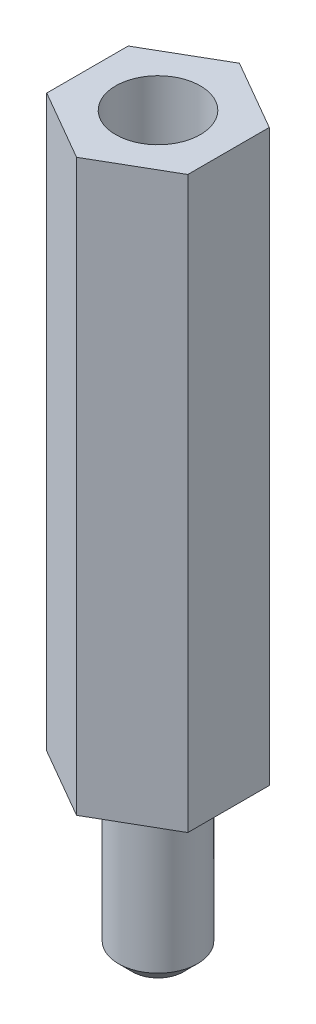
ISO-10303-21;
HEADER;
FILE_DESCRIPTION(('STEP AP214'),'2;1');
FILE_NAME('part.step','',(''),(''),'','','');
FILE_SCHEMA(('AUTOMOTIVE_DESIGN { 1 0 10303 214 1 1 1 1 }'));
ENDSEC;
DATA;
#1=APPLICATION_CONTEXT('core data for automotive mechanical design processes');
#2=APPLICATION_PROTOCOL_DEFINITION('international standard','automotive_design',2000,#1);
#3=PRODUCT_CONTEXT('',#1,'mechanical');
#4=PRODUCT('Part','Part','',(#3));
#5=PRODUCT_RELATED_PRODUCT_CATEGORY('part','',(#4));
#6=PRODUCT_DEFINITION_FORMATION('','',#4);
#7=PRODUCT_DEFINITION_CONTEXT('part definition',#1,'design');
#8=PRODUCT_DEFINITION('design','',#6,#7);
#9=PRODUCT_DEFINITION_SHAPE('','',#8);
#10=(LENGTH_UNIT() NAMED_UNIT(*) SI_UNIT(.MILLI.,.METRE.));
#11=(NAMED_UNIT(*) PLANE_ANGLE_UNIT() SI_UNIT($,.RADIAN.));
#12=(NAMED_UNIT(*) SI_UNIT($,.STERADIAN.) SOLID_ANGLE_UNIT());
#13=UNCERTAINTY_MEASURE_WITH_UNIT(LENGTH_MEASURE(1.E-05),#10,'distance_accuracy_value','');
#14=(GEOMETRIC_REPRESENTATION_CONTEXT(3) GLOBAL_UNCERTAINTY_ASSIGNED_CONTEXT((#13)) GLOBAL_UNIT_ASSIGNED_CONTEXT((#10,
#11,#12)) REPRESENTATION_CONTEXT('',''));
#15=CARTESIAN_POINT('',(0.,0.,0.));
#16=DIRECTION('',(0.,0.,1.));
#17=DIRECTION('',(1.,0.,0.));
#18=AXIS2_PLACEMENT_3D('',#15,#16,#17);
#19=CARTESIAN_POINT('',(2.49999999999998,20.2,-1.44337567297409));
#20=DIRECTION('',(-0.499999999999995,0.,0.866025403784441));
#21=DIRECTION('',(0.866025403784442,0.,0.499999999999995));
#22=AXIS2_PLACEMENT_3D('',#19,#20,#21);
#23=PLANE('',#22);
#24=DIRECTION('',(-0.866025403784442,0.,-0.499999999999995));
#25=VECTOR('',#24,1.);
#26=CARTESIAN_POINT('',(2.49999999999998,0.,-1.44337567297409));
#27=LINE('',#26,#25);
#28=CARTESIAN_POINT('',(2.49999999999998,0.,-1.44337567297409));
#29=VERTEX_POINT('',#28);
#30=CARTESIAN_POINT('',(0.,0.,-2.88675134594813));
#31=VERTEX_POINT('',#30);
#32=EDGE_CURVE('E130',#29,#31,#27,.T.);
#33=ORIENTED_EDGE('',*,*,#32,.T.);
#34=DIRECTION('',(0.,-1.,0.));
#35=VECTOR('',#34,1.);
#36=CARTESIAN_POINT('',(0.,20.2,-2.88675134594813));
#37=LINE('',#36,#35);
#38=CARTESIAN_POINT('',(0.,20.2,-2.88675134594813));
#39=VERTEX_POINT('',#38);
#40=EDGE_CURVE('E158',#39,#31,#37,.T.);
#41=ORIENTED_EDGE('',*,*,#40,.F.);
#42=DIRECTION('',(-0.866025403784442,0.,-0.499999999999995));
#43=VECTOR('',#42,1.);
#44=CARTESIAN_POINT('',(2.49999999999998,20.2,-1.44337567297409));
#45=LINE('',#44,#43);
#46=CARTESIAN_POINT('',(2.49999999999998,20.2,-1.44337567297409));
#47=VERTEX_POINT('',#46);
#48=EDGE_CURVE('E147',#47,#39,#45,.T.);
#49=ORIENTED_EDGE('',*,*,#48,.F.);
#50=DIRECTION('',(0.,-1.,0.));
#51=VECTOR('',#50,1.);
#52=CARTESIAN_POINT('',(2.49999999999998,20.2,-1.44337567297409));
#53=LINE('',#52,#51);
#54=EDGE_CURVE('E126',#47,#29,#53,.T.);
#55=ORIENTED_EDGE('',*,*,#54,.T.);
#56=EDGE_LOOP('',(#33,#41,#49,#55));
#57=FACE_BOUND('',#56,.T.);
#58=ADVANCED_FACE('F39',(#57),#23,.F.);
#59=CARTESIAN_POINT('',(0.,20.2,-2.88675134594813));
#60=DIRECTION('',(0.500000000000001,0.,0.866025403784438));
#61=DIRECTION('',(0.866025403784438,0.,-0.500000000000001));
#62=AXIS2_PLACEMENT_3D('',#59,#60,#61);
#63=PLANE('',#62);
#64=DIRECTION('',(-0.866025403784438,0.,0.500000000000001));
#65=VECTOR('',#64,1.);
#66=CARTESIAN_POINT('',(0.,0.,-2.88675134594813));
#67=LINE('',#66,#65);
#68=CARTESIAN_POINT('',(-2.50000000000001,0.,-1.44337567297406));
#69=VERTEX_POINT('',#68);
#70=EDGE_CURVE('E134',#31,#69,#67,.T.);
#71=ORIENTED_EDGE('',*,*,#70,.T.);
#72=DIRECTION('',(0.,-1.,0.));
#73=VECTOR('',#72,1.);
#74=CARTESIAN_POINT('',(-2.50000000000001,20.2,-1.44337567297406));
#75=LINE('',#74,#73);
#76=CARTESIAN_POINT('',(-2.50000000000001,20.2,-1.44337567297406));
#77=VERTEX_POINT('',#76);
#78=EDGE_CURVE('E154',#77,#69,#75,.T.);
#79=ORIENTED_EDGE('',*,*,#78,.F.);
#80=DIRECTION('',(-0.866025403784438,0.,0.500000000000001));
#81=VECTOR('',#80,1.);
#82=CARTESIAN_POINT('',(0.,20.2,-2.88675134594813));
#83=LINE('',#82,#81);
#84=EDGE_CURVE('E95',#39,#77,#83,.T.);
#85=ORIENTED_EDGE('',*,*,#84,.F.);
#86=ORIENTED_EDGE('',*,*,#40,.T.);
#87=EDGE_LOOP('',(#71,#79,#85,#86));
#88=FACE_BOUND('',#87,.T.);
#89=ADVANCED_FACE('F200',(#88),#63,.F.);
#90=CARTESIAN_POINT('',(-2.50000000000001,20.2,-1.44337567297406));
#91=DIRECTION('',(1.,0.,0.));
#92=DIRECTION('',(0.,0.,-1.));
#93=AXIS2_PLACEMENT_3D('',#90,#91,#92);
#94=PLANE('',#93);
#95=DIRECTION('',(0.,0.,1.));
#96=VECTOR('',#95,1.);
#97=CARTESIAN_POINT('',(-2.50000000000001,0.,-1.44337567297406));
#98=LINE('',#97,#96);
#99=CARTESIAN_POINT('',(-2.49999999999999,0.,1.44337567297408));
#100=VERTEX_POINT('',#99);
#101=EDGE_CURVE('E138',#69,#100,#98,.T.);
#102=ORIENTED_EDGE('',*,*,#101,.T.);
#103=DIRECTION('',(0.,-1.,0.));
#104=VECTOR('',#103,1.);
#105=CARTESIAN_POINT('',(-2.49999999999999,20.2,1.44337567297408));
#106=LINE('',#105,#104);
#107=CARTESIAN_POINT('',(-2.49999999999999,20.2,1.44337567297408));
#108=VERTEX_POINT('',#107);
#109=EDGE_CURVE('E119',#108,#100,#106,.T.);
#110=ORIENTED_EDGE('',*,*,#109,.F.);
#111=DIRECTION('',(0.,0.,1.));
#112=VECTOR('',#111,1.);
#113=CARTESIAN_POINT('',(-2.50000000000001,20.2,-1.44337567297406));
#114=LINE('',#113,#112);
#115=EDGE_CURVE('E108',#77,#108,#114,.T.);
#116=ORIENTED_EDGE('',*,*,#115,.F.);
#117=ORIENTED_EDGE('',*,*,#78,.T.);
#118=EDGE_LOOP('',(#102,#110,#116,#117));
#119=FACE_BOUND('',#118,.T.);
#120=ADVANCED_FACE('F205',(#119),#94,.F.);
#121=CARTESIAN_POINT('',(-2.49999999999999,20.2,1.44337567297408));
#122=DIRECTION('',(0.499999999999995,0.,-0.866025403784441));
#123=DIRECTION('',(-0.866025403784442,0.,-0.499999999999995));
#124=AXIS2_PLACEMENT_3D('',#121,#122,#123);
#125=PLANE('',#124);
#126=DIRECTION('',(0.866025403784441,0.,0.499999999999995));
#127=VECTOR('',#126,1.);
#128=CARTESIAN_POINT('',(-2.49999999999999,0.,1.44337567297408));
#129=LINE('',#128,#127);
#130=CARTESIAN_POINT('',(0.,0.,2.88675134594813));
#131=VERTEX_POINT('',#130);
#132=EDGE_CURVE('E117',#100,#131,#129,.T.);
#133=ORIENTED_EDGE('',*,*,#132,.T.);
#134=DIRECTION('',(0.,-1.,0.));
#135=VECTOR('',#134,1.);
#136=CARTESIAN_POINT('',(0.,20.2,2.88675134594813));
#137=LINE('',#136,#135);
#138=CARTESIAN_POINT('',(0.,20.2,2.88675134594813));
#139=VERTEX_POINT('',#138);
#140=EDGE_CURVE('E114',#139,#131,#137,.T.);
#141=ORIENTED_EDGE('',*,*,#140,.F.);
#142=DIRECTION('',(0.866025403784441,0.,0.499999999999995));
#143=VECTOR('',#142,1.);
#144=CARTESIAN_POINT('',(-2.49999999999999,20.2,1.44337567297408));
#145=LINE('',#144,#143);
#146=EDGE_CURVE('E102',#108,#139,#145,.T.);
#147=ORIENTED_EDGE('',*,*,#146,.F.);
#148=ORIENTED_EDGE('',*,*,#109,.T.);
#149=EDGE_LOOP('',(#133,#141,#147,#148));
#150=FACE_BOUND('',#149,.T.);
#151=ADVANCED_FACE('F115',(#150),#125,.F.);
#152=CARTESIAN_POINT('',(0.,20.2,2.88675134594813));
#153=DIRECTION('',(-0.500000000000007,0.,-0.866025403784435));
#154=DIRECTION('',(-0.866025403784435,0.,0.500000000000007));
#155=AXIS2_PLACEMENT_3D('',#152,#153,#154);
#156=PLANE('',#155);
#157=DIRECTION('',(0.866025403784435,0.,-0.500000000000007));
#158=VECTOR('',#157,1.);
#159=CARTESIAN_POINT('',(0.,0.,2.88675134594813));
#160=LINE('',#159,#158);
#161=CARTESIAN_POINT('',(2.50000000000002,0.,1.44337567297404));
#162=VERTEX_POINT('',#161);
#163=EDGE_CURVE('E80',#131,#162,#160,.T.);
#164=ORIENTED_EDGE('',*,*,#163,.T.);
#165=DIRECTION('',(0.,-1.,0.));
#166=VECTOR('',#165,1.);
#167=CARTESIAN_POINT('',(2.50000000000002,20.2,1.44337567297404));
#168=LINE('',#167,#166);
#169=CARTESIAN_POINT('',(2.50000000000002,20.2,1.44337567297404));
#170=VERTEX_POINT('',#169);
#171=EDGE_CURVE('E120',#170,#162,#168,.T.);
#172=ORIENTED_EDGE('',*,*,#171,.F.);
#173=DIRECTION('',(0.866025403784435,0.,-0.500000000000007));
#174=VECTOR('',#173,1.);
#175=CARTESIAN_POINT('',(0.,20.2,2.88675134594813));
#176=LINE('',#175,#174);
#177=EDGE_CURVE('E106',#139,#170,#176,.T.);
#178=ORIENTED_EDGE('',*,*,#177,.F.);
#179=ORIENTED_EDGE('',*,*,#140,.T.);
#180=EDGE_LOOP('',(#164,#172,#178,#179));
#181=FACE_BOUND('',#180,.T.);
#182=ADVANCED_FACE('F122',(#181),#156,.F.);
#183=CARTESIAN_POINT('',(2.50000000000002,20.2,1.44337567297404));
#184=DIRECTION('',(-1.,0.,0.));
#185=DIRECTION('',(0.,0.,1.));
#186=AXIS2_PLACEMENT_3D('',#183,#184,#185);
#187=PLANE('',#186);
#188=DIRECTION('',(0.,0.,-1.));
#189=VECTOR('',#188,1.);
#190=CARTESIAN_POINT('',(2.50000000000002,0.,1.44337567297404));
#191=LINE('',#190,#189);
#192=EDGE_CURVE('E86',#162,#29,#191,.T.);
#193=ORIENTED_EDGE('',*,*,#192,.T.);
#194=ORIENTED_EDGE('',*,*,#54,.F.);
#195=DIRECTION('',(0.,0.,-1.));
#196=VECTOR('',#195,1.);
#197=CARTESIAN_POINT('',(2.50000000000002,20.2,1.44337567297404));
#198=LINE('',#197,#196);
#199=EDGE_CURVE('E57',#170,#47,#198,.T.);
#200=ORIENTED_EDGE('',*,*,#199,.F.);
#201=ORIENTED_EDGE('',*,*,#171,.T.);
#202=EDGE_LOOP('',(#193,#194,#200,#201));
#203=FACE_BOUND('',#202,.T.);
#204=ADVANCED_FACE('F188',(#203),#187,.F.);
#205=CARTESIAN_POINT('',(0.,20.2,0.));
#206=DIRECTION('',(0.,1.,0.));
#207=DIRECTION('',(0.,0.,1.));
#208=AXIS2_PLACEMENT_3D('',#205,#206,#207);
#209=PLANE('',#208);
#210=CARTESIAN_POINT('',(0.,20.2,0.));
#211=DIRECTION('',(0.,1.,0.));
#212=DIRECTION('',(0.,0.,1.));
#213=AXIS2_PLACEMENT_3D('',#210,#211,#212);
#214=CIRCLE('',#213,1.5);
#215=CARTESIAN_POINT('',(0.,20.2,1.5));
#216=VERTEX_POINT('',#215);
#217=EDGE_CURVE('E172',#216,#216,#214,.T.);
#218=ORIENTED_EDGE('',*,*,#217,.F.);
#219=EDGE_LOOP('',(#218));
#220=FACE_BOUND('',#219,.T.);
#221=ORIENTED_EDGE('',*,*,#48,.T.);
#222=ORIENTED_EDGE('',*,*,#84,.T.);
#223=ORIENTED_EDGE('',*,*,#115,.T.);
#224=ORIENTED_EDGE('',*,*,#146,.T.);
#225=ORIENTED_EDGE('',*,*,#177,.T.);
#226=ORIENTED_EDGE('',*,*,#199,.T.);
#227=EDGE_LOOP('',(#221,#222,#223,#224,#225,#226));
#228=FACE_BOUND('',#227,.T.);
#229=ADVANCED_FACE('F104',(#220,#228),#209,.T.);
#230=CARTESIAN_POINT('',(0.,0.,0.));
#231=DIRECTION('',(0.,1.,0.));
#232=DIRECTION('',(0.,0.,1.));
#233=AXIS2_PLACEMENT_3D('',#230,#231,#232);
#234=PLANE('',#233);
#235=CARTESIAN_POINT('',(0.,0.,0.));
#236=DIRECTION('',(0.,-1.,0.));
#237=DIRECTION('',(0.,0.,-1.));
#238=AXIS2_PLACEMENT_3D('',#235,#236,#237);
#239=CIRCLE('',#238,1.4);
#240=CARTESIAN_POINT('',(0.,0.,-1.4));
#241=VERTEX_POINT('',#240);
#242=EDGE_CURVE('E160',#241,#241,#239,.T.);
#243=ORIENTED_EDGE('',*,*,#242,.F.);
#244=EDGE_LOOP('',(#243));
#245=FACE_BOUND('',#244,.T.);
#246=ORIENTED_EDGE('',*,*,#32,.F.);
#247=ORIENTED_EDGE('',*,*,#192,.F.);
#248=ORIENTED_EDGE('',*,*,#163,.F.);
#249=ORIENTED_EDGE('',*,*,#132,.F.);
#250=ORIENTED_EDGE('',*,*,#101,.F.);
#251=ORIENTED_EDGE('',*,*,#70,.F.);
#252=EDGE_LOOP('',(#246,#247,#248,#249,#250,#251));
#253=FACE_BOUND('',#252,.T.);
#254=ADVANCED_FACE('F187',(#245,#253),#234,.F.);
#255=CARTESIAN_POINT('',(0.,-5.8,0.));
#256=DIRECTION('',(0.,1.,0.));
#257=DIRECTION('',(0.,0.,1.));
#258=AXIS2_PLACEMENT_3D('',#255,#256,#257);
#259=CYLINDRICAL_SURFACE('',#258,1.4);
#260=CARTESIAN_POINT('',(0.,-5.3,0.));
#261=DIRECTION('',(0.,-1.,0.));
#262=DIRECTION('',(0.,0.,-1.));
#263=AXIS2_PLACEMENT_3D('',#260,#261,#262);
#264=CIRCLE('',#263,1.4);
#265=CARTESIAN_POINT('',(0.,-5.3,-1.4));
#266=VERTEX_POINT('',#265);
#267=EDGE_CURVE('E11',#266,#266,#264,.F.);
#268=ORIENTED_EDGE('',*,*,#267,.T.);
#269=EDGE_LOOP('',(#268));
#270=FACE_BOUND('',#269,.T.);
#271=ORIENTED_EDGE('',*,*,#242,.T.);
#272=EDGE_LOOP('',(#271));
#273=FACE_BOUND('',#272,.T.);
#274=ADVANCED_FACE('F194',(#270,#273),#259,.T.);
#275=CARTESIAN_POINT('',(0.,-5.8,0.));
#276=DIRECTION('',(0.,-1.,0.));
#277=DIRECTION('',(0.,0.,-1.));
#278=AXIS2_PLACEMENT_3D('',#275,#276,#277);
#279=PLANE('',#278);
#280=CARTESIAN_POINT('',(0.,-5.8,0.));
#281=DIRECTION('',(0.,-1.,0.));
#282=DIRECTION('',(0.,0.,-1.));
#283=AXIS2_PLACEMENT_3D('',#280,#281,#282);
#284=CIRCLE('',#283,0.900000000000001);
#285=CARTESIAN_POINT('',(0.,-5.8,-0.900000000000001));
#286=VERTEX_POINT('',#285);
#287=EDGE_CURVE('E49',#286,#286,#284,.T.);
#288=ORIENTED_EDGE('',*,*,#287,.T.);
#289=EDGE_LOOP('',(#288));
#290=FACE_BOUND('',#289,.T.);
#291=ADVANCED_FACE('F238',(#290),#279,.T.);
#292=CARTESIAN_POINT('',(0.,-5.8,0.));
#293=DIRECTION('',(0.,1.,0.));
#294=DIRECTION('',(0.,0.,1.));
#295=AXIS2_PLACEMENT_3D('',#292,#293,#294);
#296=CONICAL_SURFACE('',#295,0.900000000000001,0.785398163397444);
#297=ORIENTED_EDGE('',*,*,#267,.F.);
#298=EDGE_LOOP('',(#297));
#299=FACE_BOUND('',#298,.T.);
#300=ORIENTED_EDGE('',*,*,#287,.F.);
#301=EDGE_LOOP('',(#300));
#302=FACE_BOUND('',#301,.T.);
#303=ADVANCED_FACE('F41',(#299,#302),#296,.T.);
#304=CARTESIAN_POINT('',(0.,13.2,0.));
#305=DIRECTION('',(0.,1.,0.));
#306=DIRECTION('',(0.,0.,1.));
#307=AXIS2_PLACEMENT_3D('',#304,#305,#306);
#308=CYLINDRICAL_SURFACE('',#307,1.5);
#309=CARTESIAN_POINT('',(0.,13.2,0.));
#310=DIRECTION('',(0.,1.,0.));
#311=DIRECTION('',(0.,0.,1.));
#312=AXIS2_PLACEMENT_3D('',#309,#310,#311);
#313=CIRCLE('',#312,1.5);
#314=CARTESIAN_POINT('',(0.,13.2,1.5));
#315=VERTEX_POINT('',#314);
#316=EDGE_CURVE('E135',#315,#315,#313,.T.);
#317=ORIENTED_EDGE('',*,*,#316,.F.);
#318=EDGE_LOOP('',(#317));
#319=FACE_BOUND('',#318,.T.);
#320=ORIENTED_EDGE('',*,*,#217,.T.);
#321=EDGE_LOOP('',(#320));
#322=FACE_BOUND('',#321,.T.);
#323=ADVANCED_FACE('F184',(#319,#322),#308,.F.);
#324=CARTESIAN_POINT('',(0.,13.2,0.));
#325=DIRECTION('',(0.,1.,0.));
#326=DIRECTION('',(0.,0.,1.));
#327=AXIS2_PLACEMENT_3D('',#324,#325,#326);
#328=PLANE('',#327);
#329=ORIENTED_EDGE('',*,*,#316,.T.);
#330=EDGE_LOOP('',(#329));
#331=FACE_BOUND('',#330,.T.);
#332=ADVANCED_FACE('F266',(#331),#328,.T.);
#333=CLOSED_SHELL('',(#58,#89,#120,#151,#182,#204,#229,#254,#274,#291,#303,#323,#332));
#334=MANIFOLD_SOLID_BREP('B2',#333);
#335=ADVANCED_BREP_SHAPE_REPRESENTATION('',(#18,#334),#14);
#336=SHAPE_DEFINITION_REPRESENTATION(#9,#335);
ENDSEC;
END-ISO-10303-21;
